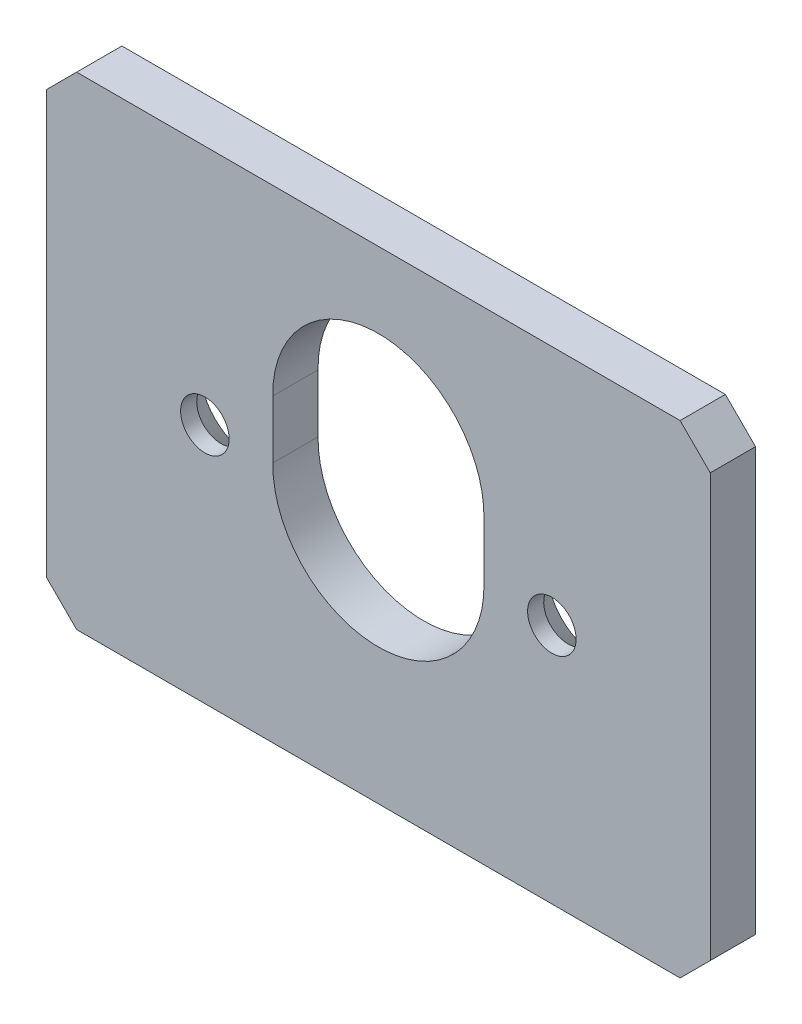
ISO-10303-21;
HEADER;
FILE_DESCRIPTION(('STEP AP214'),'2;1');
FILE_NAME('part.step','',(''),(''),'','','');
FILE_SCHEMA(('AUTOMOTIVE_DESIGN { 1 0 10303 214 1 1 1 1 }'));
ENDSEC;
DATA;
#1=APPLICATION_CONTEXT('core data for automotive mechanical design processes');
#2=APPLICATION_PROTOCOL_DEFINITION('international standard','automotive_design',2000,#1);
#3=PRODUCT_CONTEXT('',#1,'mechanical');
#4=PRODUCT('Part','Part','',(#3));
#5=PRODUCT_RELATED_PRODUCT_CATEGORY('part','',(#4));
#6=PRODUCT_DEFINITION_FORMATION('','',#4);
#7=PRODUCT_DEFINITION_CONTEXT('part definition',#1,'design');
#8=PRODUCT_DEFINITION('design','',#6,#7);
#9=PRODUCT_DEFINITION_SHAPE('','',#8);
#10=(LENGTH_UNIT() NAMED_UNIT(*) SI_UNIT(.MILLI.,.METRE.));
#11=(NAMED_UNIT(*) PLANE_ANGLE_UNIT() SI_UNIT($,.RADIAN.));
#12=(NAMED_UNIT(*) SI_UNIT($,.STERADIAN.) SOLID_ANGLE_UNIT());
#13=UNCERTAINTY_MEASURE_WITH_UNIT(LENGTH_MEASURE(1.E-05),#10,'distance_accuracy_value','');
#14=(GEOMETRIC_REPRESENTATION_CONTEXT(3) GLOBAL_UNCERTAINTY_ASSIGNED_CONTEXT((#13)) GLOBAL_UNIT_ASSIGNED_CONTEXT((#10,
#11,#12)) REPRESENTATION_CONTEXT('',''));
#15=CARTESIAN_POINT('',(0.,0.,0.));
#16=DIRECTION('',(0.,0.,1.));
#17=DIRECTION('',(1.,0.,0.));
#18=AXIS2_PLACEMENT_3D('',#15,#16,#17);
#19=CARTESIAN_POINT('',(707.110462480762,389.179264608464,-7.95807864051312E-10));
#20=DIRECTION('',(0.,0.,-1.));
#21=DIRECTION('',(0.,1.,0.));
#22=AXIS2_PLACEMENT_3D('',#19,#20,#21);
#23=CONICAL_SURFACE('',#22,5.21969999848582,0.715584992489947);
#24=CARTESIAN_POINT('',(707.110462480762,389.179264608464,3.06803254205843));
#25=DIRECTION('',(0.,0.,1.));
#26=DIRECTION('',(1.,0.,0.));
#27=AXIS2_PLACEMENT_3D('',#24,#25,#26);
#28=CIRCLE('',#27,2.5527);
#29=CARTESIAN_POINT('',(709.663162480762,389.179264608464,3.06803254205843));
#30=VERTEX_POINT('',#29);
#31=EDGE_CURVE('E338',#30,#30,#28,.T.);
#32=ORIENTED_EDGE('',*,*,#31,.T.);
#33=EDGE_LOOP('',(#32));
#34=FACE_BOUND('',#33,.T.);
#35=CARTESIAN_POINT('',(707.110462480762,389.179264608464,-1.08002495835535E-09));
#36=DIRECTION('',(0.,0.,-1.));
#37=DIRECTION('',(0.,1.,0.));
#38=AXIS2_PLACEMENT_3D('',#35,#36,#37);
#39=CIRCLE('',#38,5.21969999873288);
#40=CARTESIAN_POINT('',(707.110462480762,394.398964607197,-1.08002495835535E-09));
#41=VERTEX_POINT('',#40);
#42=EDGE_CURVE('E20',#41,#41,#39,.T.);
#43=ORIENTED_EDGE('',*,*,#42,.T.);
#44=EDGE_LOOP('',(#43));
#45=FACE_BOUND('',#44,.T.);
#46=ADVANCED_FACE('F17',(#34,#45),#23,.F.);
#47=CARTESIAN_POINT('',(670.597962480762,389.179264608464,-7.95807864051312E-10));
#48=DIRECTION('',(0.,0.,-1.));
#49=DIRECTION('',(0.,1.,0.));
#50=AXIS2_PLACEMENT_3D('',#47,#48,#49);
#51=CONICAL_SURFACE('',#50,5.21969999852778,0.715584992489947);
#52=CARTESIAN_POINT('',(670.597962480762,389.179264608464,3.06803254205843));
#53=DIRECTION('',(0.,0.,1.));
#54=DIRECTION('',(1.,0.,0.));
#55=AXIS2_PLACEMENT_3D('',#52,#53,#54);
#56=CIRCLE('',#55,2.5527);
#57=CARTESIAN_POINT('',(673.150662480762,389.179264608464,3.06803254205843));
#58=VERTEX_POINT('',#57);
#59=EDGE_CURVE('E131',#58,#58,#56,.T.);
#60=ORIENTED_EDGE('',*,*,#59,.T.);
#61=EDGE_LOOP('',(#60));
#62=FACE_BOUND('',#61,.T.);
#63=CARTESIAN_POINT('',(670.597962480762,389.179264608464,-1.08002495835535E-09));
#64=DIRECTION('',(0.,0.,-1.));
#65=DIRECTION('',(0.,1.,0.));
#66=AXIS2_PLACEMENT_3D('',#63,#64,#65);
#67=CIRCLE('',#66,5.21969999877485);
#68=CARTESIAN_POINT('',(670.597962480762,394.398964607239,-1.08002495835535E-09));
#69=VERTEX_POINT('',#68);
#70=EDGE_CURVE('E114',#69,#69,#67,.T.);
#71=ORIENTED_EDGE('',*,*,#70,.T.);
#72=EDGE_LOOP('',(#71));
#73=FACE_BOUND('',#72,.T.);
#74=ADVANCED_FACE('F158',(#62,#73),#51,.F.);
#75=CARTESIAN_POINT('',(688.854212480761,389.179264608464,0.));
#76=DIRECTION('',(0.,0.,1.));
#77=DIRECTION('',(1.,0.,0.));
#78=AXIS2_PLACEMENT_3D('',#75,#76,#77);
#79=PLANE('',#78);
#80=CARTESIAN_POINT('',(688.854212480761,395.529264608464,0.));
#81=DIRECTION('',(0.,0.,1.));
#82=DIRECTION('',(1.,0.,0.));
#83=AXIS2_PLACEMENT_3D('',#80,#81,#82);
#84=CIRCLE('',#83,11.1125);
#85=CARTESIAN_POINT('',(699.963010285383,395.242441342267,0.));
#86=VERTEX_POINT('',#85);
#87=CARTESIAN_POINT('',(677.742619883526,395.387256851397,0.));
#88=VERTEX_POINT('',#87);
#89=EDGE_CURVE('E146',#86,#88,#84,.T.);
#90=ORIENTED_EDGE('',*,*,#89,.T.);
#91=DIRECTION('',(-7.2259303567E-05,-0.999999997389297,0.));
#92=VECTOR('',#91,1.);
#93=CARTESIAN_POINT('',(677.742164059357,389.079084119593,0.));
#94=LINE('',#93,#92);
#95=CARTESIAN_POINT('',(677.742178653342,389.281050994053,0.));
#96=VERTEX_POINT('',#95);
#97=EDGE_CURVE('E60',#88,#96,#94,.T.);
#98=ORIENTED_EDGE('',*,*,#97,.T.);
#99=CARTESIAN_POINT('',(688.854212480761,389.179264608464,0.));
#100=DIRECTION('',(0.,0.,1.));
#101=DIRECTION('',(1.,0.,0.));
#102=AXIS2_PLACEMENT_3D('',#99,#100,#101);
#103=CIRCLE('',#102,11.1125);
#104=CARTESIAN_POINT('',(699.964756665355,389.387745236307,0.));
#105=VERTEX_POINT('',#104);
#106=EDGE_CURVE('E133',#96,#105,#103,.T.);
#107=ORIENTED_EDGE('',*,*,#106,.T.);
#108=DIRECTION('',(-0.000298287026866,0.999999955512424,0.));
#109=VECTOR('',#108,1.);
#110=CARTESIAN_POINT('',(699.962837197258,395.822715043866,0.));
#111=LINE('',#110,#109);
#112=EDGE_CURVE('E66',#105,#86,#111,.T.);
#113=ORIENTED_EDGE('',*,*,#112,.T.);
#114=EDGE_LOOP('',(#90,#98,#107,#113));
#115=FACE_BOUND('',#114,.T.);
#116=ORIENTED_EDGE('',*,*,#70,.F.);
#117=EDGE_LOOP('',(#116));
#118=FACE_BOUND('',#117,.T.);
#119=ORIENTED_EDGE('',*,*,#42,.F.);
#120=EDGE_LOOP('',(#119));
#121=FACE_BOUND('',#120,.T.);
#122=DIRECTION('',(1.,0.,0.));
#123=VECTOR('',#122,1.);
#124=CARTESIAN_POINT('',(653.929212480761,414.579264608464,0.));
#125=LINE('',#124,#123);
#126=CARTESIAN_POINT('',(720.604212480762,414.579264608464,0.));
#127=VERTEX_POINT('',#126);
#128=CARTESIAN_POINT('',(657.104212480761,414.579264608464,0.));
#129=VERTEX_POINT('',#128);
#130=EDGE_CURVE('E340',#127,#129,#125,.F.);
#131=ORIENTED_EDGE('',*,*,#130,.F.);
#132=DIRECTION('',(-0.70710678118654,0.707106781186555,0.));
#133=VECTOR('',#132,1.);
#134=CARTESIAN_POINT('',(722.191712480762,412.991764608464,0.));
#135=LINE('',#134,#133);
#136=CARTESIAN_POINT('',(723.779212480762,411.404264608464,0.));
#137=VERTEX_POINT('',#136);
#138=EDGE_CURVE('E74',#137,#127,#135,.T.);
#139=ORIENTED_EDGE('',*,*,#138,.F.);
#140=DIRECTION('',(0.,1.,0.));
#141=VECTOR('',#140,1.);
#142=CARTESIAN_POINT('',(723.779212480762,414.579264608464,0.));
#143=LINE('',#142,#141);
#144=CARTESIAN_POINT('',(723.779212480762,366.954264608464,0.));
#145=VERTEX_POINT('',#144);
#146=EDGE_CURVE('E357',#145,#137,#143,.T.);
#147=ORIENTED_EDGE('',*,*,#146,.F.);
#148=DIRECTION('',(0.70710678118654,0.707106781186555,0.));
#149=VECTOR('',#148,1.);
#150=CARTESIAN_POINT('',(722.191712480762,365.366764608464,0.));
#151=LINE('',#150,#149);
#152=CARTESIAN_POINT('',(720.604212480762,363.779264608464,0.));
#153=VERTEX_POINT('',#152);
#154=EDGE_CURVE('E362',#153,#145,#151,.T.);
#155=ORIENTED_EDGE('',*,*,#154,.F.);
#156=DIRECTION('',(1.,0.,0.));
#157=VECTOR('',#156,1.);
#158=CARTESIAN_POINT('',(723.779212480762,363.779264608464,0.));
#159=LINE('',#158,#157);
#160=CARTESIAN_POINT('',(657.104212480761,363.779264608464,0.));
#161=VERTEX_POINT('',#160);
#162=EDGE_CURVE('E367',#161,#153,#159,.T.);
#163=ORIENTED_EDGE('',*,*,#162,.F.);
#164=DIRECTION('',(0.70710678118654,-0.707106781186555,0.));
#165=VECTOR('',#164,1.);
#166=CARTESIAN_POINT('',(655.516712480761,365.366764608464,0.));
#167=LINE('',#166,#165);
#168=CARTESIAN_POINT('',(653.929212480761,366.954264608464,0.));
#169=VERTEX_POINT('',#168);
#170=EDGE_CURVE('E118',#169,#161,#167,.T.);
#171=ORIENTED_EDGE('',*,*,#170,.F.);
#172=DIRECTION('',(0.,1.,0.));
#173=VECTOR('',#172,1.);
#174=CARTESIAN_POINT('',(653.929212480761,363.779264608464,0.));
#175=LINE('',#174,#173);
#176=CARTESIAN_POINT('',(653.929212480761,411.404264608464,0.));
#177=VERTEX_POINT('',#176);
#178=EDGE_CURVE('E99',#177,#169,#175,.F.);
#179=ORIENTED_EDGE('',*,*,#178,.F.);
#180=DIRECTION('',(-0.70710678118654,-0.707106781186555,0.));
#181=VECTOR('',#180,1.);
#182=CARTESIAN_POINT('',(655.516712480761,412.991764608464,0.));
#183=LINE('',#182,#181);
#184=EDGE_CURVE('E105',#129,#177,#183,.T.);
#185=ORIENTED_EDGE('',*,*,#184,.F.);
#186=EDGE_LOOP('',(#131,#139,#147,#155,#163,#171,#179,#185));
#187=FACE_BOUND('',#186,.T.);
#188=ADVANCED_FACE('F116',(#115,#118,#121,#187),#79,.F.);
#189=CARTESIAN_POINT('',(655.516712480761,412.991764608464,0.));
#190=DIRECTION('',(-0.707106781186555,0.70710678118654,0.));
#191=DIRECTION('',(-0.70710678118654,-0.707106781186555,0.));
#192=AXIS2_PLACEMENT_3D('',#189,#190,#191);
#193=PLANE('',#192);
#194=ORIENTED_EDGE('',*,*,#184,.T.);
#195=DIRECTION('',(0.,0.,1.));
#196=VECTOR('',#195,1.);
#197=CARTESIAN_POINT('',(653.929212480761,411.404264608464,0.));
#198=LINE('',#197,#196);
#199=CARTESIAN_POINT('',(653.929212480761,411.404264608464,4.7625));
#200=VERTEX_POINT('',#199);
#201=EDGE_CURVE('E108',#200,#177,#198,.F.);
#202=ORIENTED_EDGE('',*,*,#201,.F.);
#203=DIRECTION('',(-0.707106781186541,-0.707106781186554,0.));
#204=VECTOR('',#203,1.);
#205=CARTESIAN_POINT('',(657.104212480761,414.579264608464,4.7625));
#206=LINE('',#205,#204);
#207=CARTESIAN_POINT('',(657.104212480761,414.579264608464,4.7625));
#208=VERTEX_POINT('',#207);
#209=EDGE_CURVE('E148',#208,#200,#206,.T.);
#210=ORIENTED_EDGE('',*,*,#209,.F.);
#211=DIRECTION('',(0.,0.,1.));
#212=VECTOR('',#211,1.);
#213=CARTESIAN_POINT('',(657.104212480761,414.579264608464,0.));
#214=LINE('',#213,#212);
#215=EDGE_CURVE('E111',#129,#208,#214,.T.);
#216=ORIENTED_EDGE('',*,*,#215,.F.);
#217=EDGE_LOOP('',(#194,#202,#210,#216));
#218=FACE_BOUND('',#217,.T.);
#219=ADVANCED_FACE('F106',(#218),#193,.T.);
#220=CARTESIAN_POINT('',(653.929212480761,363.779264608464,0.));
#221=DIRECTION('',(-1.,0.,0.));
#222=DIRECTION('',(0.,0.,1.));
#223=AXIS2_PLACEMENT_3D('',#220,#221,#222);
#224=PLANE('',#223);
#225=DIRECTION('',(0.,0.,1.));
#226=VECTOR('',#225,1.);
#227=CARTESIAN_POINT('',(653.929212480761,366.954264608464,0.));
#228=LINE('',#227,#226);
#229=CARTESIAN_POINT('',(653.929212480761,366.954264608464,4.7625));
#230=VERTEX_POINT('',#229);
#231=EDGE_CURVE('E120',#230,#169,#228,.F.);
#232=ORIENTED_EDGE('',*,*,#231,.F.);
#233=DIRECTION('',(0.,1.,0.));
#234=VECTOR('',#233,1.);
#235=CARTESIAN_POINT('',(653.929212480761,389.179264608464,4.7625));
#236=LINE('',#235,#234);
#237=EDGE_CURVE('E124',#200,#230,#236,.F.);
#238=ORIENTED_EDGE('',*,*,#237,.F.);
#239=ORIENTED_EDGE('',*,*,#201,.T.);
#240=ORIENTED_EDGE('',*,*,#178,.T.);
#241=EDGE_LOOP('',(#232,#238,#239,#240));
#242=FACE_BOUND('',#241,.T.);
#243=ADVANCED_FACE('F122',(#242),#224,.T.);
#244=CARTESIAN_POINT('',(655.516712480761,365.366764608464,0.));
#245=DIRECTION('',(-0.707106781186555,-0.70710678118654,0.));
#246=DIRECTION('',(0.70710678118654,-0.707106781186555,0.));
#247=AXIS2_PLACEMENT_3D('',#244,#245,#246);
#248=PLANE('',#247);
#249=ORIENTED_EDGE('',*,*,#170,.T.);
#250=DIRECTION('',(0.,0.,-1.));
#251=VECTOR('',#250,1.);
#252=CARTESIAN_POINT('',(657.104212480761,363.779264608464,0.));
#253=LINE('',#252,#251);
#254=CARTESIAN_POINT('',(657.104212480761,363.779264608464,4.7625));
#255=VERTEX_POINT('',#254);
#256=EDGE_CURVE('E369',#255,#161,#253,.T.);
#257=ORIENTED_EDGE('',*,*,#256,.F.);
#258=DIRECTION('',(0.707106781186541,-0.707106781186554,0.));
#259=VECTOR('',#258,1.);
#260=CARTESIAN_POINT('',(653.929212480761,366.954264608464,4.7625));
#261=LINE('',#260,#259);
#262=EDGE_CURVE('E376',#230,#255,#261,.T.);
#263=ORIENTED_EDGE('',*,*,#262,.F.);
#264=ORIENTED_EDGE('',*,*,#231,.T.);
#265=EDGE_LOOP('',(#249,#257,#263,#264));
#266=FACE_BOUND('',#265,.T.);
#267=ADVANCED_FACE('F217',(#266),#248,.T.);
#268=CARTESIAN_POINT('',(723.779212480762,363.779264608464,0.));
#269=DIRECTION('',(0.,-1.,0.));
#270=DIRECTION('',(0.,0.,-1.));
#271=AXIS2_PLACEMENT_3D('',#268,#269,#270);
#272=PLANE('',#271);
#273=DIRECTION('',(0.,0.,1.));
#274=VECTOR('',#273,1.);
#275=CARTESIAN_POINT('',(720.604212480762,363.779264608464,0.));
#276=LINE('',#275,#274);
#277=CARTESIAN_POINT('',(720.604212480762,363.779264608464,4.7625));
#278=VERTEX_POINT('',#277);
#279=EDGE_CURVE('E364',#278,#153,#276,.F.);
#280=ORIENTED_EDGE('',*,*,#279,.F.);
#281=DIRECTION('',(1.,0.,0.));
#282=VECTOR('',#281,1.);
#283=CARTESIAN_POINT('',(688.854212480761,363.779264608464,4.7625));
#284=LINE('',#283,#282);
#285=EDGE_CURVE('E400',#255,#278,#284,.T.);
#286=ORIENTED_EDGE('',*,*,#285,.F.);
#287=ORIENTED_EDGE('',*,*,#256,.T.);
#288=ORIENTED_EDGE('',*,*,#162,.T.);
#289=EDGE_LOOP('',(#280,#286,#287,#288));
#290=FACE_BOUND('',#289,.T.);
#291=ADVANCED_FACE('F213',(#290),#272,.T.);
#292=CARTESIAN_POINT('',(722.191712480762,365.366764608464,0.));
#293=DIRECTION('',(0.707106781186555,-0.70710678118654,0.));
#294=DIRECTION('',(0.70710678118654,0.707106781186555,0.));
#295=AXIS2_PLACEMENT_3D('',#292,#293,#294);
#296=PLANE('',#295);
#297=ORIENTED_EDGE('',*,*,#154,.T.);
#298=DIRECTION('',(0.,0.,-1.));
#299=VECTOR('',#298,1.);
#300=CARTESIAN_POINT('',(723.779212480762,366.954264608464,0.));
#301=LINE('',#300,#299);
#302=CARTESIAN_POINT('',(723.779212480762,366.954264608464,4.7625));
#303=VERTEX_POINT('',#302);
#304=EDGE_CURVE('E359',#303,#145,#301,.T.);
#305=ORIENTED_EDGE('',*,*,#304,.F.);
#306=DIRECTION('',(0.707106781186535,0.70710678118656,0.));
#307=VECTOR('',#306,1.);
#308=CARTESIAN_POINT('',(720.604212480762,363.779264608464,4.7625));
#309=LINE('',#308,#307);
#310=EDGE_CURVE('E397',#278,#303,#309,.T.);
#311=ORIENTED_EDGE('',*,*,#310,.F.);
#312=ORIENTED_EDGE('',*,*,#279,.T.);
#313=EDGE_LOOP('',(#297,#305,#311,#312));
#314=FACE_BOUND('',#313,.T.);
#315=ADVANCED_FACE('F209',(#314),#296,.T.);
#316=CARTESIAN_POINT('',(723.779212480762,414.579264608464,0.));
#317=DIRECTION('',(1.,0.,0.));
#318=DIRECTION('',(0.,0.,-1.));
#319=AXIS2_PLACEMENT_3D('',#316,#317,#318);
#320=PLANE('',#319);
#321=ORIENTED_EDGE('',*,*,#304,.T.);
#322=ORIENTED_EDGE('',*,*,#146,.T.);
#323=DIRECTION('',(0.,0.,1.));
#324=VECTOR('',#323,1.);
#325=CARTESIAN_POINT('',(723.779212480762,411.404264608464,0.));
#326=LINE('',#325,#324);
#327=CARTESIAN_POINT('',(723.779212480762,411.404264608464,4.7625));
#328=VERTEX_POINT('',#327);
#329=EDGE_CURVE('E355',#328,#137,#326,.F.);
#330=ORIENTED_EDGE('',*,*,#329,.F.);
#331=DIRECTION('',(0.,1.,0.));
#332=VECTOR('',#331,1.);
#333=CARTESIAN_POINT('',(723.779212480762,389.179264608464,4.7625));
#334=LINE('',#333,#332);
#335=EDGE_CURVE('E391',#303,#328,#334,.T.);
#336=ORIENTED_EDGE('',*,*,#335,.F.);
#337=EDGE_LOOP('',(#321,#322,#330,#336));
#338=FACE_BOUND('',#337,.T.);
#339=ADVANCED_FACE('F206',(#338),#320,.T.);
#340=CARTESIAN_POINT('',(722.191712480762,412.991764608464,0.));
#341=DIRECTION('',(0.707106781186555,0.70710678118654,0.));
#342=DIRECTION('',(-0.70710678118654,0.707106781186555,0.));
#343=AXIS2_PLACEMENT_3D('',#340,#341,#342);
#344=PLANE('',#343);
#345=ORIENTED_EDGE('',*,*,#138,.T.);
#346=DIRECTION('',(0.,0.,1.));
#347=VECTOR('',#346,1.);
#348=CARTESIAN_POINT('',(720.604212480762,414.579264608464,0.));
#349=LINE('',#348,#347);
#350=CARTESIAN_POINT('',(720.604212480762,414.579264608464,4.7625));
#351=VERTEX_POINT('',#350);
#352=EDGE_CURVE('E344',#351,#127,#349,.F.);
#353=ORIENTED_EDGE('',*,*,#352,.F.);
#354=DIRECTION('',(-0.707106781186535,0.70710678118656,0.));
#355=VECTOR('',#354,1.);
#356=CARTESIAN_POINT('',(723.779212480762,411.404264608464,4.7625));
#357=LINE('',#356,#355);
#358=EDGE_CURVE('E389',#328,#351,#357,.T.);
#359=ORIENTED_EDGE('',*,*,#358,.F.);
#360=ORIENTED_EDGE('',*,*,#329,.T.);
#361=EDGE_LOOP('',(#345,#353,#359,#360));
#362=FACE_BOUND('',#361,.T.);
#363=ADVANCED_FACE('F202',(#362),#344,.T.);
#364=CARTESIAN_POINT('',(653.929212480761,414.579264608464,0.));
#365=DIRECTION('',(0.,1.,0.));
#366=DIRECTION('',(0.,0.,1.));
#367=AXIS2_PLACEMENT_3D('',#364,#365,#366);
#368=PLANE('',#367);
#369=ORIENTED_EDGE('',*,*,#352,.T.);
#370=ORIENTED_EDGE('',*,*,#130,.T.);
#371=ORIENTED_EDGE('',*,*,#215,.T.);
#372=DIRECTION('',(1.,0.,0.));
#373=VECTOR('',#372,1.);
#374=CARTESIAN_POINT('',(688.854212480761,414.579264608464,4.7625));
#375=LINE('',#374,#373);
#376=EDGE_CURVE('E145',#351,#208,#375,.F.);
#377=ORIENTED_EDGE('',*,*,#376,.F.);
#378=EDGE_LOOP('',(#369,#370,#371,#377));
#379=FACE_BOUND('',#378,.T.);
#380=ADVANCED_FACE('F198',(#379),#368,.T.);
#381=CARTESIAN_POINT('',(707.110462480762,389.179264608464,2.38125));
#382=DIRECTION('',(0.,0.,1.));
#383=DIRECTION('',(1.,0.,0.));
#384=AXIS2_PLACEMENT_3D('',#381,#382,#383);
#385=CYLINDRICAL_SURFACE('',#384,2.5527);
#386=CARTESIAN_POINT('',(707.110462480762,389.179264608464,4.7625));
#387=DIRECTION('',(0.,0.,1.));
#388=DIRECTION('',(1.,0.,0.));
#389=AXIS2_PLACEMENT_3D('',#386,#387,#388);
#390=CIRCLE('',#389,2.5527);
#391=CARTESIAN_POINT('',(709.663162480762,389.179264608464,4.7625));
#392=VERTEX_POINT('',#391);
#393=EDGE_CURVE('E142',#392,#392,#390,.F.);
#394=ORIENTED_EDGE('',*,*,#393,.F.);
#395=EDGE_LOOP('',(#394));
#396=FACE_BOUND('',#395,.T.);
#397=ORIENTED_EDGE('',*,*,#31,.F.);
#398=EDGE_LOOP('',(#397));
#399=FACE_BOUND('',#398,.T.);
#400=ADVANCED_FACE('F194',(#396,#399),#385,.F.);
#401=CARTESIAN_POINT('',(670.597962480762,389.179264608464,2.38125));
#402=DIRECTION('',(0.,0.,1.));
#403=DIRECTION('',(1.,0.,0.));
#404=AXIS2_PLACEMENT_3D('',#401,#402,#403);
#405=CYLINDRICAL_SURFACE('',#404,2.5527);
#406=CARTESIAN_POINT('',(670.597962480762,389.179264608464,4.7625));
#407=DIRECTION('',(0.,0.,1.));
#408=DIRECTION('',(1.,0.,0.));
#409=AXIS2_PLACEMENT_3D('',#406,#407,#408);
#410=CIRCLE('',#409,2.5527);
#411=CARTESIAN_POINT('',(673.150662480762,389.179264608464,4.7625));
#412=VERTEX_POINT('',#411);
#413=EDGE_CURVE('E139',#412,#412,#410,.F.);
#414=ORIENTED_EDGE('',*,*,#413,.F.);
#415=EDGE_LOOP('',(#414));
#416=FACE_BOUND('',#415,.T.);
#417=ORIENTED_EDGE('',*,*,#59,.F.);
#418=EDGE_LOOP('',(#417));
#419=FACE_BOUND('',#418,.T.);
#420=ADVANCED_FACE('F191',(#416,#419),#405,.F.);
#421=CARTESIAN_POINT('',(699.962837197258,395.822715043866,0.));
#422=DIRECTION('',(0.999999955512424,0.000298287026866,0.));
#423=DIRECTION('',(-0.000298287026866,0.999999955512424,0.));
#424=AXIS2_PLACEMENT_3D('',#421,#422,#423);
#425=PLANE('',#424);
#426=DIRECTION('',(0.000298287026858752,-0.999999955512424,0.));
#427=VECTOR('',#426,1.);
#428=CARTESIAN_POINT('',(699.963010285383,395.242441342268,4.7625));
#429=LINE('',#428,#427);
#430=CARTESIAN_POINT('',(699.963010285383,395.242441342268,4.7625));
#431=VERTEX_POINT('',#430);
#432=CARTESIAN_POINT('',(699.964756665355,389.387745236307,4.7625));
#433=VERTEX_POINT('',#432);
#434=EDGE_CURVE('E138',#431,#433,#429,.T.);
#435=ORIENTED_EDGE('',*,*,#434,.F.);
#436=DIRECTION('',(0.,0.,1.));
#437=VECTOR('',#436,1.);
#438=CARTESIAN_POINT('',(699.963010285383,395.242441342268,0.));
#439=LINE('',#438,#437);
#440=EDGE_CURVE('E149',#431,#86,#439,.F.);
#441=ORIENTED_EDGE('',*,*,#440,.T.);
#442=ORIENTED_EDGE('',*,*,#112,.F.);
#443=DIRECTION('',(0.,0.,1.));
#444=VECTOR('',#443,1.);
#445=CARTESIAN_POINT('',(699.964756665355,389.387745236304,0.));
#446=LINE('',#445,#444);
#447=EDGE_CURVE('E130',#105,#433,#446,.T.);
#448=ORIENTED_EDGE('',*,*,#447,.T.);
#449=EDGE_LOOP('',(#435,#441,#442,#448));
#450=FACE_BOUND('',#449,.T.);
#451=ADVANCED_FACE('F187',(#450),#425,.F.);
#452=CARTESIAN_POINT('',(688.854212480761,389.179264608464,0.));
#453=DIRECTION('',(0.,0.,1.));
#454=DIRECTION('',(1.,0.,0.));
#455=AXIS2_PLACEMENT_3D('',#452,#453,#454);
#456=CYLINDRICAL_SURFACE('',#455,11.1125);
#457=DIRECTION('',(0.,0.,1.));
#458=VECTOR('',#457,1.);
#459=CARTESIAN_POINT('',(677.742178653342,389.281050994048,0.));
#460=LINE('',#459,#458);
#461=CARTESIAN_POINT('',(677.742178653342,389.281050994045,4.7625));
#462=VERTEX_POINT('',#461);
#463=EDGE_CURVE('E132',#96,#462,#460,.T.);
#464=ORIENTED_EDGE('',*,*,#463,.T.);
#465=CARTESIAN_POINT('',(688.854212480761,389.179264608464,4.7625));
#466=DIRECTION('',(0.,0.,1.));
#467=DIRECTION('',(1.,0.,0.));
#468=AXIS2_PLACEMENT_3D('',#465,#466,#467);
#469=CIRCLE('',#468,11.1125);
#470=EDGE_CURVE('E135',#433,#462,#469,.F.);
#471=ORIENTED_EDGE('',*,*,#470,.F.);
#472=ORIENTED_EDGE('',*,*,#447,.F.);
#473=ORIENTED_EDGE('',*,*,#106,.F.);
#474=EDGE_LOOP('',(#464,#471,#472,#473));
#475=FACE_BOUND('',#474,.T.);
#476=ADVANCED_FACE('F184',(#475),#456,.F.);
#477=CARTESIAN_POINT('',(677.742164059357,389.079084119593,0.));
#478=DIRECTION('',(-0.999999997389297,7.2259303567E-05,0.));
#479=DIRECTION('',(-7.2259303567E-05,-0.999999997389297,0.));
#480=AXIS2_PLACEMENT_3D('',#477,#478,#479);
#481=PLANE('',#480);
#482=ORIENTED_EDGE('',*,*,#97,.F.);
#483=DIRECTION('',(0.,0.,1.));
#484=VECTOR('',#483,1.);
#485=CARTESIAN_POINT('',(677.742619883526,395.387256851398,0.));
#486=LINE('',#485,#484);
#487=CARTESIAN_POINT('',(677.742619883526,395.387256851399,4.7625));
#488=VERTEX_POINT('',#487);
#489=EDGE_CURVE('E35',#88,#488,#486,.T.);
#490=ORIENTED_EDGE('',*,*,#489,.T.);
#491=DIRECTION('',(7.22593035841051E-05,0.999999997389297,0.));
#492=VECTOR('',#491,1.);
#493=CARTESIAN_POINT('',(677.742178653342,389.281050994048,4.7625));
#494=LINE('',#493,#492);
#495=EDGE_CURVE('E26',#462,#488,#494,.T.);
#496=ORIENTED_EDGE('',*,*,#495,.F.);
#497=ORIENTED_EDGE('',*,*,#463,.F.);
#498=EDGE_LOOP('',(#482,#490,#496,#497));
#499=FACE_BOUND('',#498,.T.);
#500=ADVANCED_FACE('F176',(#499),#481,.F.);
#501=CARTESIAN_POINT('',(688.854212480761,395.529264608464,0.));
#502=DIRECTION('',(0.,0.,1.));
#503=DIRECTION('',(1.,0.,0.));
#504=AXIS2_PLACEMENT_3D('',#501,#502,#503);
#505=CYLINDRICAL_SURFACE('',#504,11.1125);
#506=ORIENTED_EDGE('',*,*,#440,.F.);
#507=CARTESIAN_POINT('',(688.854212480761,395.529264608464,4.7625));
#508=DIRECTION('',(0.,0.,1.));
#509=DIRECTION('',(1.,0.,0.));
#510=AXIS2_PLACEMENT_3D('',#507,#508,#509);
#511=CIRCLE('',#510,11.1125);
#512=EDGE_CURVE('E11',#488,#431,#511,.F.);
#513=ORIENTED_EDGE('',*,*,#512,.F.);
#514=ORIENTED_EDGE('',*,*,#489,.F.);
#515=ORIENTED_EDGE('',*,*,#89,.F.);
#516=EDGE_LOOP('',(#506,#513,#514,#515));
#517=FACE_BOUND('',#516,.T.);
#518=ADVANCED_FACE('F170',(#517),#505,.F.);
#519=CARTESIAN_POINT('',(688.854212480761,389.179264608464,4.7625));
#520=DIRECTION('',(0.,0.,1.));
#521=DIRECTION('',(1.,0.,0.));
#522=AXIS2_PLACEMENT_3D('',#519,#520,#521);
#523=PLANE('',#522);
#524=ORIENTED_EDGE('',*,*,#495,.T.);
#525=ORIENTED_EDGE('',*,*,#512,.T.);
#526=ORIENTED_EDGE('',*,*,#434,.T.);
#527=ORIENTED_EDGE('',*,*,#470,.T.);
#528=EDGE_LOOP('',(#524,#525,#526,#527));
#529=FACE_BOUND('',#528,.T.);
#530=ORIENTED_EDGE('',*,*,#413,.T.);
#531=EDGE_LOOP('',(#530));
#532=FACE_BOUND('',#531,.T.);
#533=ORIENTED_EDGE('',*,*,#393,.T.);
#534=EDGE_LOOP('',(#533));
#535=FACE_BOUND('',#534,.T.);
#536=ORIENTED_EDGE('',*,*,#358,.T.);
#537=ORIENTED_EDGE('',*,*,#376,.T.);
#538=ORIENTED_EDGE('',*,*,#209,.T.);
#539=ORIENTED_EDGE('',*,*,#237,.T.);
#540=ORIENTED_EDGE('',*,*,#262,.T.);
#541=ORIENTED_EDGE('',*,*,#285,.T.);
#542=ORIENTED_EDGE('',*,*,#310,.T.);
#543=ORIENTED_EDGE('',*,*,#335,.T.);
#544=EDGE_LOOP('',(#536,#537,#538,#539,#540,#541,#542,#543));
#545=FACE_BOUND('',#544,.T.);
#546=ADVANCED_FACE('F168',(#529,#532,#535,#545),#523,.T.);
#547=CLOSED_SHELL('',(#46,#74,#188,#219,#243,#267,#291,#315,#339,#363,#380,#400,#420,#451,#476,
#500,#518,#546));
#548=MANIFOLD_SOLID_BREP('B1',#547);
#549=ADVANCED_BREP_SHAPE_REPRESENTATION('',(#18,#548),#14);
#550=SHAPE_DEFINITION_REPRESENTATION(#9,#549);
ENDSEC;
END-ISO-10303-21;
